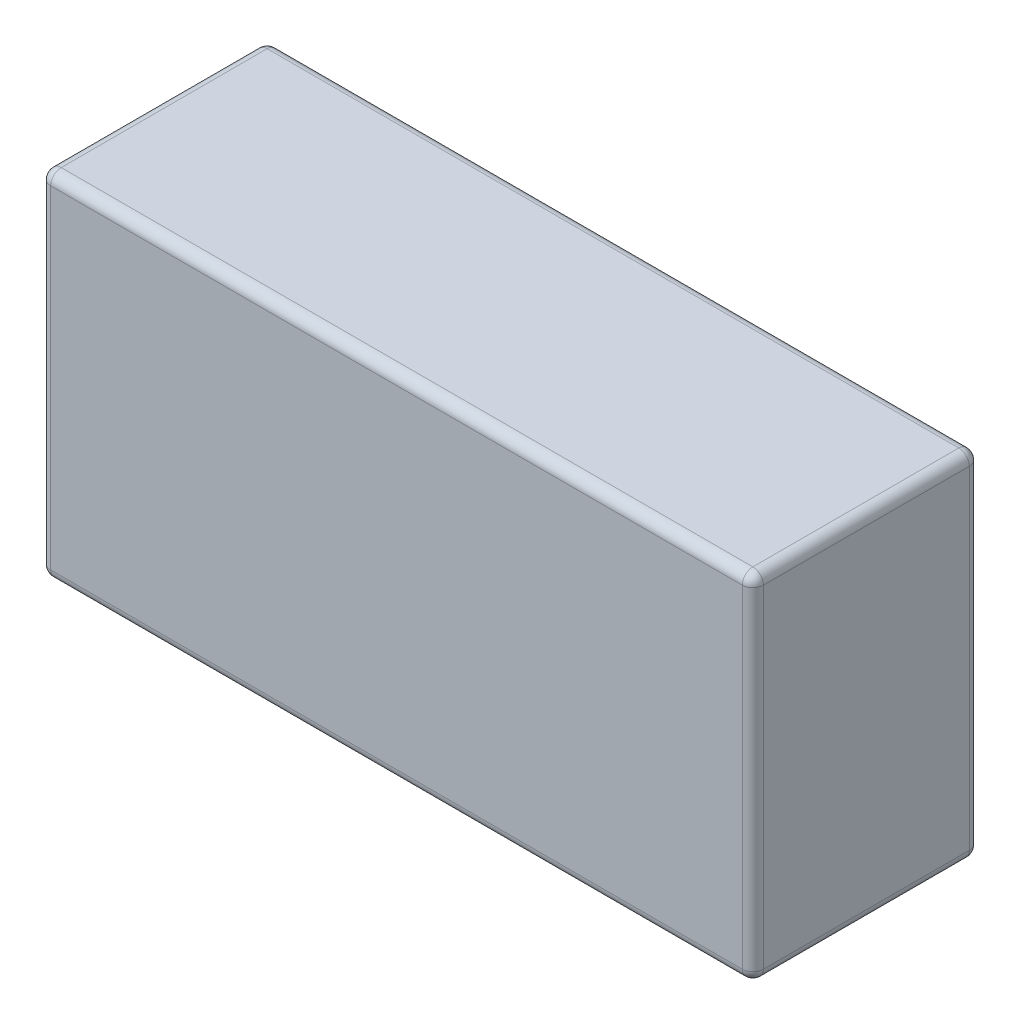
ISO-10303-21;
HEADER;
FILE_DESCRIPTION(('STEP AP214'),'2;1');
FILE_NAME('part.step','',(''),(''),'','','');
FILE_SCHEMA(('AUTOMOTIVE_DESIGN { 1 0 10303 214 1 1 1 1 }'));
ENDSEC;
DATA;
#1=APPLICATION_CONTEXT('core data for automotive mechanical design processes');
#2=APPLICATION_PROTOCOL_DEFINITION('international standard','automotive_design',2000,#1);
#3=PRODUCT_CONTEXT('',#1,'mechanical');
#4=PRODUCT('Part','Part','',(#3));
#5=PRODUCT_RELATED_PRODUCT_CATEGORY('part','',(#4));
#6=PRODUCT_DEFINITION_FORMATION('','',#4);
#7=PRODUCT_DEFINITION_CONTEXT('part definition',#1,'design');
#8=PRODUCT_DEFINITION('design','',#6,#7);
#9=PRODUCT_DEFINITION_SHAPE('','',#8);
#10=(LENGTH_UNIT() NAMED_UNIT(*) SI_UNIT(.MILLI.,.METRE.));
#11=(NAMED_UNIT(*) PLANE_ANGLE_UNIT() SI_UNIT($,.RADIAN.));
#12=(NAMED_UNIT(*) SI_UNIT($,.STERADIAN.) SOLID_ANGLE_UNIT());
#13=UNCERTAINTY_MEASURE_WITH_UNIT(LENGTH_MEASURE(1.E-05),#10,'distance_accuracy_value','');
#14=(GEOMETRIC_REPRESENTATION_CONTEXT(3) GLOBAL_UNCERTAINTY_ASSIGNED_CONTEXT((#13)) GLOBAL_UNIT_ASSIGNED_CONTEXT((#10,
#11,#12)) REPRESENTATION_CONTEXT('',''));
#15=CARTESIAN_POINT('',(0.,0.,0.));
#16=DIRECTION('',(0.,0.,1.));
#17=DIRECTION('',(1.,0.,0.));
#18=AXIS2_PLACEMENT_3D('',#15,#16,#17);
#19=CARTESIAN_POINT('',(0.,67.,0.));
#20=DIRECTION('',(-1.,0.,0.));
#21=DIRECTION('',(0.,0.,1.));
#22=AXIS2_PLACEMENT_3D('',#19,#20,#21);
#23=PLANE('',#22);
#24=DIRECTION('',(0.,0.,-1.));
#25=VECTOR('',#24,1.);
#26=CARTESIAN_POINT('',(0.,2.,0.));
#27=LINE('',#26,#25);
#28=CARTESIAN_POINT('',(0.,2.,-2.));
#29=VERTEX_POINT('',#28);
#30=CARTESIAN_POINT('',(0.,2.,-41.));
#31=VERTEX_POINT('',#30);
#32=EDGE_CURVE('E191',#29,#31,#27,.T.);
#33=ORIENTED_EDGE('',*,*,#32,.T.);
#34=DIRECTION('',(0.,-1.,0.));
#35=VECTOR('',#34,1.);
#36=CARTESIAN_POINT('',(0.,67.,-41.));
#37=LINE('',#36,#35);
#38=CARTESIAN_POINT('',(0.,65.,-41.));
#39=VERTEX_POINT('',#38);
#40=EDGE_CURVE('E193',#31,#39,#37,.F.);
#41=ORIENTED_EDGE('',*,*,#40,.T.);
#42=DIRECTION('',(0.,0.,-1.));
#43=VECTOR('',#42,1.);
#44=CARTESIAN_POINT('',(0.,65.,0.));
#45=LINE('',#44,#43);
#46=CARTESIAN_POINT('',(0.,65.,-2.));
#47=VERTEX_POINT('',#46);
#48=EDGE_CURVE('E189',#39,#47,#45,.F.);
#49=ORIENTED_EDGE('',*,*,#48,.T.);
#50=DIRECTION('',(0.,-1.,0.));
#51=VECTOR('',#50,1.);
#52=CARTESIAN_POINT('',(0.,67.,-2.));
#53=LINE('',#52,#51);
#54=EDGE_CURVE('E187',#47,#29,#53,.T.);
#55=ORIENTED_EDGE('',*,*,#54,.T.);
#56=EDGE_LOOP('',(#33,#41,#49,#55));
#57=FACE_BOUND('',#56,.T.);
#58=ADVANCED_FACE('F43',(#57),#23,.F.);
#59=CARTESIAN_POINT('',(0.,67.,-43.));
#60=DIRECTION('',(0.,0.,1.));
#61=DIRECTION('',(1.,0.,0.));
#62=AXIS2_PLACEMENT_3D('',#59,#60,#61);
#63=PLANE('',#62);
#64=DIRECTION('',(-1.,0.,0.));
#65=VECTOR('',#64,1.);
#66=CARTESIAN_POINT('',(0.,2.,-43.));
#67=LINE('',#66,#65);
#68=CARTESIAN_POINT('',(-2.,2.,-43.));
#69=VERTEX_POINT('',#68);
#70=CARTESIAN_POINT('',(-133.,2.,-43.));
#71=VERTEX_POINT('',#70);
#72=EDGE_CURVE('E182',#69,#71,#67,.T.);
#73=ORIENTED_EDGE('',*,*,#72,.T.);
#74=DIRECTION('',(0.,-1.,0.));
#75=VECTOR('',#74,1.);
#76=CARTESIAN_POINT('',(-133.,67.,-43.));
#77=LINE('',#76,#75);
#78=CARTESIAN_POINT('',(-133.,65.,-43.));
#79=VERTEX_POINT('',#78);
#80=EDGE_CURVE('E184',#71,#79,#77,.F.);
#81=ORIENTED_EDGE('',*,*,#80,.T.);
#82=DIRECTION('',(-1.,0.,0.));
#83=VECTOR('',#82,1.);
#84=CARTESIAN_POINT('',(0.,65.,-43.));
#85=LINE('',#84,#83);
#86=CARTESIAN_POINT('',(-2.,65.,-43.));
#87=VERTEX_POINT('',#86);
#88=EDGE_CURVE('E178',#79,#87,#85,.F.);
#89=ORIENTED_EDGE('',*,*,#88,.T.);
#90=DIRECTION('',(0.,-1.,0.));
#91=VECTOR('',#90,1.);
#92=CARTESIAN_POINT('',(-2.,67.,-43.));
#93=LINE('',#92,#91);
#94=EDGE_CURVE('E180',#87,#69,#93,.T.);
#95=ORIENTED_EDGE('',*,*,#94,.T.);
#96=EDGE_LOOP('',(#73,#81,#89,#95));
#97=FACE_BOUND('',#96,.T.);
#98=ADVANCED_FACE('F296',(#97),#63,.F.);
#99=CARTESIAN_POINT('',(-135.,67.,0.));
#100=DIRECTION('',(1.,0.,0.));
#101=DIRECTION('',(0.,0.,-1.));
#102=AXIS2_PLACEMENT_3D('',#99,#100,#101);
#103=PLANE('',#102);
#104=DIRECTION('',(0.,-1.,0.));
#105=VECTOR('',#104,1.);
#106=CARTESIAN_POINT('',(-135.,67.,-41.));
#107=LINE('',#106,#105);
#108=CARTESIAN_POINT('',(-135.,65.,-41.));
#109=VERTEX_POINT('',#108);
#110=CARTESIAN_POINT('',(-135.,2.,-41.));
#111=VERTEX_POINT('',#110);
#112=EDGE_CURVE('E165',#109,#111,#107,.T.);
#113=ORIENTED_EDGE('',*,*,#112,.T.);
#114=DIRECTION('',(0.,0.,1.));
#115=VECTOR('',#114,1.);
#116=CARTESIAN_POINT('',(-135.,2.,0.));
#117=LINE('',#116,#115);
#118=CARTESIAN_POINT('',(-135.,2.,-2.));
#119=VERTEX_POINT('',#118);
#120=EDGE_CURVE('E137',#111,#119,#117,.T.);
#121=ORIENTED_EDGE('',*,*,#120,.T.);
#122=DIRECTION('',(0.,-1.,0.));
#123=VECTOR('',#122,1.);
#124=CARTESIAN_POINT('',(-135.,67.,-2.));
#125=LINE('',#124,#123);
#126=CARTESIAN_POINT('',(-135.,65.,-2.));
#127=VERTEX_POINT('',#126);
#128=EDGE_CURVE('E155',#119,#127,#125,.F.);
#129=ORIENTED_EDGE('',*,*,#128,.T.);
#130=DIRECTION('',(0.,0.,1.));
#131=VECTOR('',#130,1.);
#132=CARTESIAN_POINT('',(-135.,65.,-43.));
#133=LINE('',#132,#131);
#134=EDGE_CURVE('E161',#127,#109,#133,.F.);
#135=ORIENTED_EDGE('',*,*,#134,.T.);
#136=EDGE_LOOP('',(#113,#121,#129,#135));
#137=FACE_BOUND('',#136,.T.);
#138=ADVANCED_FACE('F163',(#137),#103,.F.);
#139=CARTESIAN_POINT('',(0.,67.,0.));
#140=DIRECTION('',(0.,0.,-1.));
#141=DIRECTION('',(-1.,0.,0.));
#142=AXIS2_PLACEMENT_3D('',#139,#140,#141);
#143=PLANE('',#142);
#144=DIRECTION('',(1.,0.,0.));
#145=VECTOR('',#144,1.);
#146=CARTESIAN_POINT('',(-135.,65.,0.));
#147=LINE('',#146,#145);
#148=CARTESIAN_POINT('',(-2.,65.,0.));
#149=VERTEX_POINT('',#148);
#150=CARTESIAN_POINT('',(-133.,65.,0.));
#151=VERTEX_POINT('',#150);
#152=EDGE_CURVE('E52',#149,#151,#147,.F.);
#153=ORIENTED_EDGE('',*,*,#152,.T.);
#154=DIRECTION('',(0.,-1.,0.));
#155=VECTOR('',#154,1.);
#156=CARTESIAN_POINT('',(-133.,67.,0.));
#157=LINE('',#156,#155);
#158=CARTESIAN_POINT('',(-133.,2.,0.));
#159=VERTEX_POINT('',#158);
#160=EDGE_CURVE('E11',#151,#159,#157,.T.);
#161=ORIENTED_EDGE('',*,*,#160,.T.);
#162=DIRECTION('',(1.,0.,0.));
#163=VECTOR('',#162,1.);
#164=CARTESIAN_POINT('',(0.,2.,0.));
#165=LINE('',#164,#163);
#166=CARTESIAN_POINT('',(-2.,2.,0.));
#167=VERTEX_POINT('',#166);
#168=EDGE_CURVE('E205',#159,#167,#165,.T.);
#169=ORIENTED_EDGE('',*,*,#168,.T.);
#170=DIRECTION('',(0.,-1.,0.));
#171=VECTOR('',#170,1.);
#172=CARTESIAN_POINT('',(-2.,67.,0.));
#173=LINE('',#172,#171);
#174=EDGE_CURVE('E63',#167,#149,#173,.F.);
#175=ORIENTED_EDGE('',*,*,#174,.T.);
#176=EDGE_LOOP('',(#153,#161,#169,#175));
#177=FACE_BOUND('',#176,.T.);
#178=ADVANCED_FACE('F336',(#177),#143,.F.);
#179=CARTESIAN_POINT('',(0.,67.,0.));
#180=DIRECTION('',(0.,1.,0.));
#181=DIRECTION('',(0.,0.,1.));
#182=AXIS2_PLACEMENT_3D('',#179,#180,#181);
#183=PLANE('',#182);
#184=DIRECTION('',(-1.,0.,0.));
#185=VECTOR('',#184,1.);
#186=CARTESIAN_POINT('',(-135.,67.,-41.));
#187=LINE('',#186,#185);
#188=CARTESIAN_POINT('',(-2.,67.,-41.));
#189=VERTEX_POINT('',#188);
#190=CARTESIAN_POINT('',(-133.,67.,-41.));
#191=VERTEX_POINT('',#190);
#192=EDGE_CURVE('E200',#189,#191,#187,.T.);
#193=ORIENTED_EDGE('',*,*,#192,.T.);
#194=DIRECTION('',(0.,0.,1.));
#195=VECTOR('',#194,1.);
#196=CARTESIAN_POINT('',(-133.,67.,0.));
#197=LINE('',#196,#195);
#198=CARTESIAN_POINT('',(-133.,67.,-2.));
#199=VERTEX_POINT('',#198);
#200=EDGE_CURVE('E202',#191,#199,#197,.T.);
#201=ORIENTED_EDGE('',*,*,#200,.T.);
#202=DIRECTION('',(1.,0.,0.));
#203=VECTOR('',#202,1.);
#204=CARTESIAN_POINT('',(0.,67.,-2.));
#205=LINE('',#204,#203);
#206=CARTESIAN_POINT('',(-2.,67.,-2.));
#207=VERTEX_POINT('',#206);
#208=EDGE_CURVE('E196',#199,#207,#205,.T.);
#209=ORIENTED_EDGE('',*,*,#208,.T.);
#210=DIRECTION('',(0.,0.,-1.));
#211=VECTOR('',#210,1.);
#212=CARTESIAN_POINT('',(-2.,67.,-43.));
#213=LINE('',#212,#211);
#214=EDGE_CURVE('E198',#207,#189,#213,.T.);
#215=ORIENTED_EDGE('',*,*,#214,.T.);
#216=EDGE_LOOP('',(#193,#201,#209,#215));
#217=FACE_BOUND('',#216,.T.);
#218=ADVANCED_FACE('F310',(#217),#183,.T.);
#219=CARTESIAN_POINT('',(0.,0.,0.));
#220=DIRECTION('',(0.,1.,0.));
#221=DIRECTION('',(0.,0.,1.));
#222=AXIS2_PLACEMENT_3D('',#219,#220,#221);
#223=PLANE('',#222);
#224=DIRECTION('',(1.,0.,0.));
#225=VECTOR('',#224,1.);
#226=CARTESIAN_POINT('',(0.,0.,-2.));
#227=LINE('',#226,#225);
#228=CARTESIAN_POINT('',(-2.,0.,-2.));
#229=VERTEX_POINT('',#228);
#230=CARTESIAN_POINT('',(-133.,0.,-2.));
#231=VERTEX_POINT('',#230);
#232=EDGE_CURVE('E167',#229,#231,#227,.F.);
#233=ORIENTED_EDGE('',*,*,#232,.T.);
#234=DIRECTION('',(0.,0.,1.));
#235=VECTOR('',#234,1.);
#236=CARTESIAN_POINT('',(-133.,0.,0.));
#237=LINE('',#236,#235);
#238=CARTESIAN_POINT('',(-133.,0.,-41.));
#239=VERTEX_POINT('',#238);
#240=EDGE_CURVE('E139',#231,#239,#237,.F.);
#241=ORIENTED_EDGE('',*,*,#240,.T.);
#242=DIRECTION('',(-1.,0.,0.));
#243=VECTOR('',#242,1.);
#244=CARTESIAN_POINT('',(0.,0.,-41.));
#245=LINE('',#244,#243);
#246=CARTESIAN_POINT('',(-2.,0.,-41.));
#247=VERTEX_POINT('',#246);
#248=EDGE_CURVE('E175',#239,#247,#245,.F.);
#249=ORIENTED_EDGE('',*,*,#248,.T.);
#250=DIRECTION('',(0.,0.,-1.));
#251=VECTOR('',#250,1.);
#252=CARTESIAN_POINT('',(-2.,0.,0.));
#253=LINE('',#252,#251);
#254=EDGE_CURVE('E169',#247,#229,#253,.F.);
#255=ORIENTED_EDGE('',*,*,#254,.T.);
#256=EDGE_LOOP('',(#233,#241,#249,#255));
#257=FACE_BOUND('',#256,.T.);
#258=ADVANCED_FACE('F329',(#257),#223,.F.);
#259=CARTESIAN_POINT('',(-2.,65.,0.));
#260=DIRECTION('',(0.,0.,1.));
#261=DIRECTION('',(1.,0.,0.));
#262=AXIS2_PLACEMENT_3D('',#259,#260,#261);
#263=CYLINDRICAL_SURFACE('',#262,2.);
#264=CARTESIAN_POINT('',(-2.,65.,-41.));
#265=DIRECTION('',(0.,0.,-1.));
#266=DIRECTION('',(-1.,0.,0.));
#267=AXIS2_PLACEMENT_3D('',#264,#265,#266);
#268=CIRCLE('',#267,2.);
#269=EDGE_CURVE('E47',#189,#39,#268,.T.);
#270=ORIENTED_EDGE('',*,*,#269,.F.);
#271=ORIENTED_EDGE('',*,*,#214,.F.);
#272=CARTESIAN_POINT('',(-2.,65.,-2.));
#273=DIRECTION('',(0.,0.,1.));
#274=DIRECTION('',(1.,0.,0.));
#275=AXIS2_PLACEMENT_3D('',#272,#273,#274);
#276=CIRCLE('',#275,2.);
#277=EDGE_CURVE('E257',#47,#207,#276,.T.);
#278=ORIENTED_EDGE('',*,*,#277,.F.);
#279=ORIENTED_EDGE('',*,*,#48,.F.);
#280=EDGE_LOOP('',(#270,#271,#278,#279));
#281=FACE_BOUND('',#280,.T.);
#282=ADVANCED_FACE('F45',(#281),#263,.T.);
#283=CARTESIAN_POINT('',(-2.,65.,-41.));
#284=DIRECTION('',(1.,0.,0.));
#285=DIRECTION('',(0.,0.,-1.));
#286=AXIS2_PLACEMENT_3D('',#283,#284,#285);
#287=SPHERICAL_SURFACE('',#286,2.);
#288=CARTESIAN_POINT('',(-2.,65.,-41.));
#289=DIRECTION('',(1.,0.,0.));
#290=DIRECTION('',(0.,0.,-1.));
#291=AXIS2_PLACEMENT_3D('',#288,#289,#290);
#292=CIRCLE('',#291,2.);
#293=EDGE_CURVE('E253',#189,#87,#292,.F.);
#294=ORIENTED_EDGE('',*,*,#293,.F.);
#295=ORIENTED_EDGE('',*,*,#269,.T.);
#296=CARTESIAN_POINT('',(-2.,65.,-41.));
#297=DIRECTION('',(0.,1.,0.));
#298=DIRECTION('',(0.,0.,1.));
#299=AXIS2_PLACEMENT_3D('',#296,#297,#298);
#300=CIRCLE('',#299,2.);
#301=EDGE_CURVE('E256',#87,#39,#300,.F.);
#302=ORIENTED_EDGE('',*,*,#301,.F.);
#303=EDGE_LOOP('',(#294,#295,#302));
#304=FACE_BOUND('',#303,.T.);
#305=ADVANCED_FACE('F269',(#304),#287,.T.);
#306=CARTESIAN_POINT('',(-2.,65.,-2.));
#307=DIRECTION('',(0.,1.,0.));
#308=DIRECTION('',(0.,0.,1.));
#309=AXIS2_PLACEMENT_3D('',#306,#307,#308);
#310=SPHERICAL_SURFACE('',#309,2.);
#311=CARTESIAN_POINT('',(-2.,65.,-2.));
#312=DIRECTION('',(0.,1.,0.));
#313=DIRECTION('',(0.,0.,1.));
#314=AXIS2_PLACEMENT_3D('',#311,#312,#313);
#315=CIRCLE('',#314,2.);
#316=EDGE_CURVE('E248',#47,#149,#315,.F.);
#317=ORIENTED_EDGE('',*,*,#316,.F.);
#318=ORIENTED_EDGE('',*,*,#277,.T.);
#319=CARTESIAN_POINT('',(-2.,65.,-2.));
#320=DIRECTION('',(1.,0.,0.));
#321=DIRECTION('',(0.,0.,-1.));
#322=AXIS2_PLACEMENT_3D('',#319,#320,#321);
#323=CIRCLE('',#322,2.);
#324=EDGE_CURVE('E250',#149,#207,#323,.F.);
#325=ORIENTED_EDGE('',*,*,#324,.F.);
#326=EDGE_LOOP('',(#317,#318,#325));
#327=FACE_BOUND('',#326,.T.);
#328=ADVANCED_FACE('F318',(#327),#310,.T.);
#329=CARTESIAN_POINT('',(-2.,67.,-41.));
#330=DIRECTION('',(0.,-1.,0.));
#331=DIRECTION('',(0.,0.,-1.));
#332=AXIS2_PLACEMENT_3D('',#329,#330,#331);
#333=CYLINDRICAL_SURFACE('',#332,2.);
#334=ORIENTED_EDGE('',*,*,#301,.T.);
#335=ORIENTED_EDGE('',*,*,#40,.F.);
#336=CARTESIAN_POINT('',(-2.,2.,-41.));
#337=DIRECTION('',(0.,-1.,0.));
#338=DIRECTION('',(0.,0.,-1.));
#339=AXIS2_PLACEMENT_3D('',#336,#337,#338);
#340=CIRCLE('',#339,2.);
#341=EDGE_CURVE('E242',#69,#31,#340,.T.);
#342=ORIENTED_EDGE('',*,*,#341,.F.);
#343=ORIENTED_EDGE('',*,*,#94,.F.);
#344=EDGE_LOOP('',(#334,#335,#342,#343));
#345=FACE_BOUND('',#344,.T.);
#346=ADVANCED_FACE('F280',(#345),#333,.T.);
#347=CARTESIAN_POINT('',(0.,65.,-41.));
#348=DIRECTION('',(1.,0.,0.));
#349=DIRECTION('',(0.,0.,-1.));
#350=AXIS2_PLACEMENT_3D('',#347,#348,#349);
#351=CYLINDRICAL_SURFACE('',#350,2.);
#352=ORIENTED_EDGE('',*,*,#293,.T.);
#353=ORIENTED_EDGE('',*,*,#88,.F.);
#354=CARTESIAN_POINT('',(-133.,65.,-41.));
#355=DIRECTION('',(-1.,0.,0.));
#356=DIRECTION('',(0.,0.,1.));
#357=AXIS2_PLACEMENT_3D('',#354,#355,#356);
#358=CIRCLE('',#357,2.);
#359=EDGE_CURVE('E239',#191,#79,#358,.T.);
#360=ORIENTED_EDGE('',*,*,#359,.F.);
#361=ORIENTED_EDGE('',*,*,#192,.F.);
#362=EDGE_LOOP('',(#352,#353,#360,#361));
#363=FACE_BOUND('',#362,.T.);
#364=ADVANCED_FACE('F307',(#363),#351,.T.);
#365=CARTESIAN_POINT('',(-133.,65.,0.));
#366=DIRECTION('',(0.,0.,-1.));
#367=DIRECTION('',(-1.,0.,0.));
#368=AXIS2_PLACEMENT_3D('',#365,#366,#367);
#369=CYLINDRICAL_SURFACE('',#368,2.);
#370=CARTESIAN_POINT('',(-133.,65.,-2.));
#371=DIRECTION('',(0.,0.,1.));
#372=DIRECTION('',(1.,0.,0.));
#373=AXIS2_PLACEMENT_3D('',#370,#371,#372);
#374=CIRCLE('',#373,2.);
#375=EDGE_CURVE('E233',#199,#127,#374,.T.);
#376=ORIENTED_EDGE('',*,*,#375,.F.);
#377=ORIENTED_EDGE('',*,*,#200,.F.);
#378=CARTESIAN_POINT('',(-133.,65.,-41.));
#379=DIRECTION('',(0.,0.,-1.));
#380=DIRECTION('',(-1.,0.,0.));
#381=AXIS2_PLACEMENT_3D('',#378,#379,#380);
#382=CIRCLE('',#381,2.);
#383=EDGE_CURVE('E236',#109,#191,#382,.T.);
#384=ORIENTED_EDGE('',*,*,#383,.F.);
#385=ORIENTED_EDGE('',*,*,#134,.F.);
#386=EDGE_LOOP('',(#376,#377,#384,#385));
#387=FACE_BOUND('',#386,.T.);
#388=ADVANCED_FACE('F313',(#387),#369,.T.);
#389=CARTESIAN_POINT('',(0.,65.,-2.));
#390=DIRECTION('',(-1.,0.,0.));
#391=DIRECTION('',(0.,0.,1.));
#392=AXIS2_PLACEMENT_3D('',#389,#390,#391);
#393=CYLINDRICAL_SURFACE('',#392,2.);
#394=ORIENTED_EDGE('',*,*,#324,.T.);
#395=ORIENTED_EDGE('',*,*,#208,.F.);
#396=CARTESIAN_POINT('',(-133.,65.,-2.));
#397=DIRECTION('',(-1.,0.,0.));
#398=DIRECTION('',(0.,0.,1.));
#399=AXIS2_PLACEMENT_3D('',#396,#397,#398);
#400=CIRCLE('',#399,2.);
#401=EDGE_CURVE('E231',#151,#199,#400,.T.);
#402=ORIENTED_EDGE('',*,*,#401,.F.);
#403=ORIENTED_EDGE('',*,*,#152,.F.);
#404=EDGE_LOOP('',(#394,#395,#402,#403));
#405=FACE_BOUND('',#404,.T.);
#406=ADVANCED_FACE('F317',(#405),#393,.T.);
#407=CARTESIAN_POINT('',(-2.,67.,-2.));
#408=DIRECTION('',(0.,-1.,0.));
#409=DIRECTION('',(0.,0.,-1.));
#410=AXIS2_PLACEMENT_3D('',#407,#408,#409);
#411=CYLINDRICAL_SURFACE('',#410,2.);
#412=ORIENTED_EDGE('',*,*,#316,.T.);
#413=ORIENTED_EDGE('',*,*,#174,.F.);
#414=CARTESIAN_POINT('',(-2.,2.,-2.));
#415=DIRECTION('',(0.,-1.,0.));
#416=DIRECTION('',(0.,0.,-1.));
#417=AXIS2_PLACEMENT_3D('',#414,#415,#416);
#418=CIRCLE('',#417,2.);
#419=EDGE_CURVE('E228',#29,#167,#418,.T.);
#420=ORIENTED_EDGE('',*,*,#419,.F.);
#421=ORIENTED_EDGE('',*,*,#54,.F.);
#422=EDGE_LOOP('',(#412,#413,#420,#421));
#423=FACE_BOUND('',#422,.T.);
#424=ADVANCED_FACE('F321',(#423),#411,.T.);
#425=CARTESIAN_POINT('',(-2.,2.,0.));
#426=DIRECTION('',(0.,0.,-1.));
#427=DIRECTION('',(-1.,0.,0.));
#428=AXIS2_PLACEMENT_3D('',#425,#426,#427);
#429=CYLINDRICAL_SURFACE('',#428,2.);
#430=CARTESIAN_POINT('',(-2.,2.,-41.));
#431=DIRECTION('',(0.,0.,-1.));
#432=DIRECTION('',(-1.,0.,0.));
#433=AXIS2_PLACEMENT_3D('',#430,#431,#432);
#434=CIRCLE('',#433,2.);
#435=EDGE_CURVE('E245',#31,#247,#434,.T.);
#436=ORIENTED_EDGE('',*,*,#435,.F.);
#437=ORIENTED_EDGE('',*,*,#32,.F.);
#438=CARTESIAN_POINT('',(-2.,2.,-2.));
#439=DIRECTION('',(0.,0.,1.));
#440=DIRECTION('',(1.,0.,0.));
#441=AXIS2_PLACEMENT_3D('',#438,#439,#440);
#442=CIRCLE('',#441,2.);
#443=EDGE_CURVE('E225',#229,#29,#442,.T.);
#444=ORIENTED_EDGE('',*,*,#443,.F.);
#445=ORIENTED_EDGE('',*,*,#254,.F.);
#446=EDGE_LOOP('',(#436,#437,#444,#445));
#447=FACE_BOUND('',#446,.T.);
#448=ADVANCED_FACE('F284',(#447),#429,.T.);
#449=CARTESIAN_POINT('',(-2.,2.,-41.));
#450=DIRECTION('',(1.,0.,0.));
#451=DIRECTION('',(0.,1.,0.));
#452=AXIS2_PLACEMENT_3D('',#449,#450,#451);
#453=SPHERICAL_SURFACE('',#452,2.);
#454=ORIENTED_EDGE('',*,*,#341,.T.);
#455=ORIENTED_EDGE('',*,*,#435,.T.);
#456=CARTESIAN_POINT('',(-2.,2.,-41.));
#457=DIRECTION('',(1.,0.,0.));
#458=DIRECTION('',(0.,0.,-1.));
#459=AXIS2_PLACEMENT_3D('',#456,#457,#458);
#460=CIRCLE('',#459,2.);
#461=EDGE_CURVE('E222',#69,#247,#460,.F.);
#462=ORIENTED_EDGE('',*,*,#461,.F.);
#463=EDGE_LOOP('',(#454,#455,#462));
#464=FACE_BOUND('',#463,.T.);
#465=ADVANCED_FACE('F288',(#464),#453,.T.);
#466=CARTESIAN_POINT('',(-133.,65.,-41.));
#467=DIRECTION('',(0.,1.,0.));
#468=DIRECTION('',(0.,0.,1.));
#469=AXIS2_PLACEMENT_3D('',#466,#467,#468);
#470=SPHERICAL_SURFACE('',#469,2.);
#471=ORIENTED_EDGE('',*,*,#383,.T.);
#472=ORIENTED_EDGE('',*,*,#359,.T.);
#473=CARTESIAN_POINT('',(-133.,65.,-41.));
#474=DIRECTION('',(0.,1.,0.));
#475=DIRECTION('',(0.,0.,1.));
#476=AXIS2_PLACEMENT_3D('',#473,#474,#475);
#477=CIRCLE('',#476,2.);
#478=EDGE_CURVE('E220',#109,#79,#477,.F.);
#479=ORIENTED_EDGE('',*,*,#478,.F.);
#480=EDGE_LOOP('',(#471,#472,#479));
#481=FACE_BOUND('',#480,.T.);
#482=ADVANCED_FACE('F304',(#481),#470,.T.);
#483=CARTESIAN_POINT('',(-133.,65.,-2.));
#484=DIRECTION('',(0.,1.,0.));
#485=DIRECTION('',(0.,0.,1.));
#486=AXIS2_PLACEMENT_3D('',#483,#484,#485);
#487=SPHERICAL_SURFACE('',#486,2.);
#488=ORIENTED_EDGE('',*,*,#401,.T.);
#489=ORIENTED_EDGE('',*,*,#375,.T.);
#490=CARTESIAN_POINT('',(-133.,65.,-2.));
#491=DIRECTION('',(0.,1.,0.));
#492=DIRECTION('',(0.,0.,1.));
#493=AXIS2_PLACEMENT_3D('',#490,#491,#492);
#494=CIRCLE('',#493,2.);
#495=EDGE_CURVE('E158',#151,#127,#494,.F.);
#496=ORIENTED_EDGE('',*,*,#495,.F.);
#497=EDGE_LOOP('',(#488,#489,#496));
#498=FACE_BOUND('',#497,.T.);
#499=ADVANCED_FACE('F365',(#498),#487,.T.);
#500=CARTESIAN_POINT('',(-2.,2.,-2.));
#501=DIRECTION('',(1.,0.,0.));
#502=DIRECTION('',(0.,1.,0.));
#503=AXIS2_PLACEMENT_3D('',#500,#501,#502);
#504=SPHERICAL_SURFACE('',#503,2.);
#505=ORIENTED_EDGE('',*,*,#443,.T.);
#506=ORIENTED_EDGE('',*,*,#419,.T.);
#507=CARTESIAN_POINT('',(-2.,2.,-2.));
#508=DIRECTION('',(1.,0.,0.));
#509=DIRECTION('',(0.,0.,-1.));
#510=AXIS2_PLACEMENT_3D('',#507,#508,#509);
#511=CIRCLE('',#510,2.);
#512=EDGE_CURVE('E216',#229,#167,#511,.F.);
#513=ORIENTED_EDGE('',*,*,#512,.F.);
#514=EDGE_LOOP('',(#505,#506,#513));
#515=FACE_BOUND('',#514,.T.);
#516=ADVANCED_FACE('F324',(#515),#504,.T.);
#517=CARTESIAN_POINT('',(0.,2.,-41.));
#518=DIRECTION('',(-1.,0.,0.));
#519=DIRECTION('',(0.,0.,1.));
#520=AXIS2_PLACEMENT_3D('',#517,#518,#519);
#521=CYLINDRICAL_SURFACE('',#520,2.);
#522=ORIENTED_EDGE('',*,*,#461,.T.);
#523=ORIENTED_EDGE('',*,*,#248,.F.);
#524=CARTESIAN_POINT('',(-133.,2.,-41.));
#525=DIRECTION('',(-1.,0.,0.));
#526=DIRECTION('',(0.,0.,1.));
#527=AXIS2_PLACEMENT_3D('',#524,#525,#526);
#528=CIRCLE('',#527,2.);
#529=EDGE_CURVE('E213',#71,#239,#528,.T.);
#530=ORIENTED_EDGE('',*,*,#529,.F.);
#531=ORIENTED_EDGE('',*,*,#72,.F.);
#532=EDGE_LOOP('',(#522,#523,#530,#531));
#533=FACE_BOUND('',#532,.T.);
#534=ADVANCED_FACE('F293',(#533),#521,.T.);
#535=CARTESIAN_POINT('',(-133.,67.,-41.));
#536=DIRECTION('',(0.,-1.,0.));
#537=DIRECTION('',(0.,0.,-1.));
#538=AXIS2_PLACEMENT_3D('',#535,#536,#537);
#539=CYLINDRICAL_SURFACE('',#538,2.);
#540=ORIENTED_EDGE('',*,*,#478,.T.);
#541=ORIENTED_EDGE('',*,*,#80,.F.);
#542=CARTESIAN_POINT('',(-133.,2.,-41.));
#543=DIRECTION('',(0.,-1.,0.));
#544=DIRECTION('',(0.,0.,-1.));
#545=AXIS2_PLACEMENT_3D('',#542,#543,#544);
#546=CIRCLE('',#545,2.);
#547=EDGE_CURVE('E152',#111,#71,#546,.T.);
#548=ORIENTED_EDGE('',*,*,#547,.F.);
#549=ORIENTED_EDGE('',*,*,#112,.F.);
#550=EDGE_LOOP('',(#540,#541,#548,#549));
#551=FACE_BOUND('',#550,.T.);
#552=ADVANCED_FACE('F298',(#551),#539,.T.);
#553=CARTESIAN_POINT('',(-133.,67.,-2.));
#554=DIRECTION('',(0.,-1.,0.));
#555=DIRECTION('',(0.,0.,-1.));
#556=AXIS2_PLACEMENT_3D('',#553,#554,#555);
#557=CYLINDRICAL_SURFACE('',#556,2.);
#558=ORIENTED_EDGE('',*,*,#495,.T.);
#559=ORIENTED_EDGE('',*,*,#128,.F.);
#560=CARTESIAN_POINT('',(-133.,2.,-2.));
#561=DIRECTION('',(0.,-1.,0.));
#562=DIRECTION('',(0.,0.,-1.));
#563=AXIS2_PLACEMENT_3D('',#560,#561,#562);
#564=CIRCLE('',#563,2.);
#565=EDGE_CURVE('E144',#159,#119,#564,.T.);
#566=ORIENTED_EDGE('',*,*,#565,.F.);
#567=ORIENTED_EDGE('',*,*,#160,.F.);
#568=EDGE_LOOP('',(#558,#559,#566,#567));
#569=FACE_BOUND('',#568,.T.);
#570=ADVANCED_FACE('F156',(#569),#557,.T.);
#571=CARTESIAN_POINT('',(0.,2.,-2.));
#572=DIRECTION('',(1.,0.,0.));
#573=DIRECTION('',(0.,0.,-1.));
#574=AXIS2_PLACEMENT_3D('',#571,#572,#573);
#575=CYLINDRICAL_SURFACE('',#574,2.);
#576=ORIENTED_EDGE('',*,*,#512,.T.);
#577=ORIENTED_EDGE('',*,*,#168,.F.);
#578=CARTESIAN_POINT('',(-133.,2.,-2.));
#579=DIRECTION('',(-1.,0.,0.));
#580=DIRECTION('',(0.,0.,1.));
#581=AXIS2_PLACEMENT_3D('',#578,#579,#580);
#582=CIRCLE('',#581,2.);
#583=EDGE_CURVE('E148',#231,#159,#582,.T.);
#584=ORIENTED_EDGE('',*,*,#583,.F.);
#585=ORIENTED_EDGE('',*,*,#232,.F.);
#586=EDGE_LOOP('',(#576,#577,#584,#585));
#587=FACE_BOUND('',#586,.T.);
#588=ADVANCED_FACE('F327',(#587),#575,.T.);
#589=CARTESIAN_POINT('',(-133.,2.,-41.));
#590=DIRECTION('',(0.,0.,-1.));
#591=DIRECTION('',(0.,1.,0.));
#592=AXIS2_PLACEMENT_3D('',#589,#590,#591);
#593=SPHERICAL_SURFACE('',#592,2.);
#594=ORIENTED_EDGE('',*,*,#547,.T.);
#595=ORIENTED_EDGE('',*,*,#529,.T.);
#596=CARTESIAN_POINT('',(-133.,2.,-41.));
#597=DIRECTION('',(0.,0.,-1.));
#598=DIRECTION('',(-1.,0.,0.));
#599=AXIS2_PLACEMENT_3D('',#596,#597,#598);
#600=CIRCLE('',#599,2.);
#601=EDGE_CURVE('E141',#111,#239,#600,.F.);
#602=ORIENTED_EDGE('',*,*,#601,.F.);
#603=EDGE_LOOP('',(#594,#595,#602));
#604=FACE_BOUND('',#603,.T.);
#605=ADVANCED_FACE('F351',(#604),#593,.T.);
#606=CARTESIAN_POINT('',(-133.,2.,-2.));
#607=DIRECTION('',(0.,0.,1.));
#608=DIRECTION('',(0.,-1.,0.));
#609=AXIS2_PLACEMENT_3D('',#606,#607,#608);
#610=SPHERICAL_SURFACE('',#609,2.);
#611=ORIENTED_EDGE('',*,*,#583,.T.);
#612=ORIENTED_EDGE('',*,*,#565,.T.);
#613=CARTESIAN_POINT('',(-133.,2.,-2.));
#614=DIRECTION('',(0.,0.,1.));
#615=DIRECTION('',(1.,0.,0.));
#616=AXIS2_PLACEMENT_3D('',#613,#614,#615);
#617=CIRCLE('',#616,2.);
#618=EDGE_CURVE('E133',#231,#119,#617,.F.);
#619=ORIENTED_EDGE('',*,*,#618,.F.);
#620=EDGE_LOOP('',(#611,#612,#619));
#621=FACE_BOUND('',#620,.T.);
#622=ADVANCED_FACE('F146',(#621),#610,.T.);
#623=CARTESIAN_POINT('',(-133.,2.,0.));
#624=DIRECTION('',(0.,0.,1.));
#625=DIRECTION('',(1.,0.,0.));
#626=AXIS2_PLACEMENT_3D('',#623,#624,#625);
#627=CYLINDRICAL_SURFACE('',#626,2.);
#628=ORIENTED_EDGE('',*,*,#601,.T.);
#629=ORIENTED_EDGE('',*,*,#240,.F.);
#630=ORIENTED_EDGE('',*,*,#618,.T.);
#631=ORIENTED_EDGE('',*,*,#120,.F.);
#632=EDGE_LOOP('',(#628,#629,#630,#631));
#633=FACE_BOUND('',#632,.T.);
#634=ADVANCED_FACE('F135',(#633),#627,.T.);
#635=CLOSED_SHELL('',(#58,#98,#138,#178,#218,#258,#282,#305,#328,#346,#364,#388,#406,#424,#448,
#465,#482,#499,#516,#534,#552,#570,#588,#605,#622,#634));
#636=MANIFOLD_SOLID_BREP('B2',#635);
#637=ADVANCED_BREP_SHAPE_REPRESENTATION('',(#18,#636),#14);
#638=SHAPE_DEFINITION_REPRESENTATION(#9,#637);
ENDSEC;
END-ISO-10303-21;
